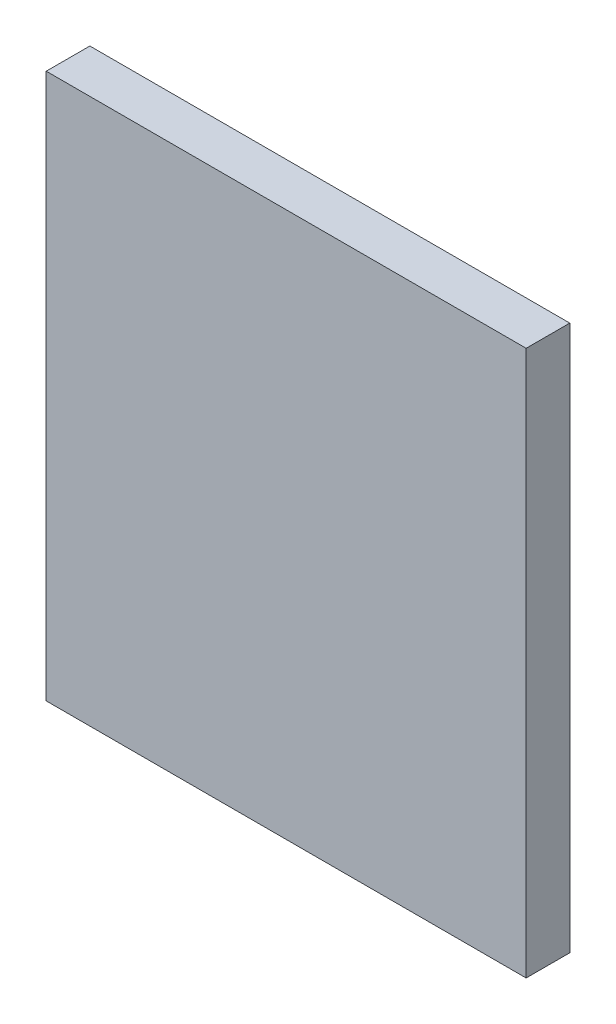
ISO-10303-21;
HEADER;
FILE_DESCRIPTION(('STEP AP214'),'2;1');
FILE_NAME('part.step','',(''),(''),'','','');
FILE_SCHEMA(('AUTOMOTIVE_DESIGN { 1 0 10303 214 1 1 1 1 }'));
ENDSEC;
DATA;
#1=APPLICATION_CONTEXT('core data for automotive mechanical design processes');
#2=APPLICATION_PROTOCOL_DEFINITION('international standard','automotive_design',2000,#1);
#3=PRODUCT_CONTEXT('',#1,'mechanical');
#4=PRODUCT('Part','Part','',(#3));
#5=PRODUCT_RELATED_PRODUCT_CATEGORY('part','',(#4));
#6=PRODUCT_DEFINITION_FORMATION('','',#4);
#7=PRODUCT_DEFINITION_CONTEXT('part definition',#1,'design');
#8=PRODUCT_DEFINITION('design','',#6,#7);
#9=PRODUCT_DEFINITION_SHAPE('','',#8);
#10=(LENGTH_UNIT() NAMED_UNIT(*) SI_UNIT(.MILLI.,.METRE.));
#11=(NAMED_UNIT(*) PLANE_ANGLE_UNIT() SI_UNIT($,.RADIAN.));
#12=(NAMED_UNIT(*) SI_UNIT($,.STERADIAN.) SOLID_ANGLE_UNIT());
#13=UNCERTAINTY_MEASURE_WITH_UNIT(LENGTH_MEASURE(1.E-05),#10,'distance_accuracy_value','');
#14=(GEOMETRIC_REPRESENTATION_CONTEXT(3) GLOBAL_UNCERTAINTY_ASSIGNED_CONTEXT((#13)) GLOBAL_UNIT_ASSIGNED_CONTEXT((#10,
#11,#12)) REPRESENTATION_CONTEXT('',''));
#15=CARTESIAN_POINT('',(0.,0.,0.));
#16=DIRECTION('',(0.,0.,1.));
#17=DIRECTION('',(1.,0.,0.));
#18=AXIS2_PLACEMENT_3D('',#15,#16,#17);
#19=CARTESIAN_POINT('',(0.,0.,2.));
#20=DIRECTION('',(1.,0.,0.));
#21=DIRECTION('',(0.,0.,-1.));
#22=AXIS2_PLACEMENT_3D('',#19,#20,#21);
#23=PLANE('',#22);
#24=DIRECTION('',(0.,-1.,0.));
#25=VECTOR('',#24,1.);
#26=CARTESIAN_POINT('',(0.,0.,0.));
#27=LINE('',#26,#25);
#28=CARTESIAN_POINT('',(0.,25.,0.));
#29=VERTEX_POINT('',#28);
#30=CARTESIAN_POINT('',(0.,0.,0.));
#31=VERTEX_POINT('',#30);
#32=EDGE_CURVE('E100',#29,#31,#27,.T.);
#33=ORIENTED_EDGE('',*,*,#32,.T.);
#34=DIRECTION('',(0.,0.,-1.));
#35=VECTOR('',#34,1.);
#36=CARTESIAN_POINT('',(0.,0.,2.));
#37=LINE('',#36,#35);
#38=CARTESIAN_POINT('',(0.,0.,2.));
#39=VERTEX_POINT('',#38);
#40=EDGE_CURVE('E11',#39,#31,#37,.T.);
#41=ORIENTED_EDGE('',*,*,#40,.F.);
#42=DIRECTION('',(0.,-1.,0.));
#43=VECTOR('',#42,1.);
#44=CARTESIAN_POINT('',(0.,0.,2.));
#45=LINE('',#44,#43);
#46=CARTESIAN_POINT('',(0.,25.,2.));
#47=VERTEX_POINT('',#46);
#48=EDGE_CURVE('E88',#47,#39,#45,.T.);
#49=ORIENTED_EDGE('',*,*,#48,.F.);
#50=DIRECTION('',(0.,0.,-1.));
#51=VECTOR('',#50,1.);
#52=CARTESIAN_POINT('',(0.,25.,2.));
#53=LINE('',#52,#51);
#54=EDGE_CURVE('E96',#47,#29,#53,.T.);
#55=ORIENTED_EDGE('',*,*,#54,.T.);
#56=EDGE_LOOP('',(#33,#41,#49,#55));
#57=FACE_BOUND('',#56,.T.);
#58=ADVANCED_FACE('F37',(#57),#23,.F.);
#59=CARTESIAN_POINT('',(0.,0.,2.));
#60=DIRECTION('',(0.,1.,0.));
#61=DIRECTION('',(0.,0.,1.));
#62=AXIS2_PLACEMENT_3D('',#59,#60,#61);
#63=PLANE('',#62);
#64=DIRECTION('',(1.,0.,0.));
#65=VECTOR('',#64,1.);
#66=CARTESIAN_POINT('',(0.,0.,0.));
#67=LINE('',#66,#65);
#68=CARTESIAN_POINT('',(22.,0.,0.));
#69=VERTEX_POINT('',#68);
#70=EDGE_CURVE('E92',#31,#69,#67,.T.);
#71=ORIENTED_EDGE('',*,*,#70,.T.);
#72=DIRECTION('',(0.,0.,-1.));
#73=VECTOR('',#72,1.);
#74=CARTESIAN_POINT('',(22.,0.,2.));
#75=LINE('',#74,#73);
#76=CARTESIAN_POINT('',(22.,0.,2.));
#77=VERTEX_POINT('',#76);
#78=EDGE_CURVE('E45',#77,#69,#75,.T.);
#79=ORIENTED_EDGE('',*,*,#78,.F.);
#80=DIRECTION('',(1.,0.,0.));
#81=VECTOR('',#80,1.);
#82=CARTESIAN_POINT('',(0.,0.,2.));
#83=LINE('',#82,#81);
#84=EDGE_CURVE('E83',#39,#77,#83,.T.);
#85=ORIENTED_EDGE('',*,*,#84,.F.);
#86=ORIENTED_EDGE('',*,*,#40,.T.);
#87=EDGE_LOOP('',(#71,#79,#85,#86));
#88=FACE_BOUND('',#87,.T.);
#89=ADVANCED_FACE('F91',(#88),#63,.F.);
#90=CARTESIAN_POINT('',(22.,0.,2.));
#91=DIRECTION('',(-1.,0.,0.));
#92=DIRECTION('',(0.,0.,1.));
#93=AXIS2_PLACEMENT_3D('',#90,#91,#92);
#94=PLANE('',#93);
#95=DIRECTION('',(0.,1.,0.));
#96=VECTOR('',#95,1.);
#97=CARTESIAN_POINT('',(22.,0.,0.));
#98=LINE('',#97,#96);
#99=CARTESIAN_POINT('',(22.,25.,0.));
#100=VERTEX_POINT('',#99);
#101=EDGE_CURVE('E70',#69,#100,#98,.T.);
#102=ORIENTED_EDGE('',*,*,#101,.T.);
#103=DIRECTION('',(0.,0.,-1.));
#104=VECTOR('',#103,1.);
#105=CARTESIAN_POINT('',(22.,25.,2.));
#106=LINE('',#105,#104);
#107=CARTESIAN_POINT('',(22.,25.,2.));
#108=VERTEX_POINT('',#107);
#109=EDGE_CURVE('E93',#108,#100,#106,.T.);
#110=ORIENTED_EDGE('',*,*,#109,.F.);
#111=DIRECTION('',(0.,1.,0.));
#112=VECTOR('',#111,1.);
#113=CARTESIAN_POINT('',(22.,0.,2.));
#114=LINE('',#113,#112);
#115=EDGE_CURVE('E86',#77,#108,#114,.T.);
#116=ORIENTED_EDGE('',*,*,#115,.F.);
#117=ORIENTED_EDGE('',*,*,#78,.T.);
#118=EDGE_LOOP('',(#102,#110,#116,#117));
#119=FACE_BOUND('',#118,.T.);
#120=ADVANCED_FACE('F94',(#119),#94,.F.);
#121=CARTESIAN_POINT('',(0.,25.,2.));
#122=DIRECTION('',(0.,-1.,0.));
#123=DIRECTION('',(0.,0.,-1.));
#124=AXIS2_PLACEMENT_3D('',#121,#122,#123);
#125=PLANE('',#124);
#126=DIRECTION('',(-1.,0.,0.));
#127=VECTOR('',#126,1.);
#128=CARTESIAN_POINT('',(0.,25.,0.));
#129=LINE('',#128,#127);
#130=EDGE_CURVE('E76',#100,#29,#129,.T.);
#131=ORIENTED_EDGE('',*,*,#130,.T.);
#132=ORIENTED_EDGE('',*,*,#54,.F.);
#133=DIRECTION('',(-1.,0.,0.));
#134=VECTOR('',#133,1.);
#135=CARTESIAN_POINT('',(0.,25.,2.));
#136=LINE('',#135,#134);
#137=EDGE_CURVE('E53',#108,#47,#136,.T.);
#138=ORIENTED_EDGE('',*,*,#137,.F.);
#139=ORIENTED_EDGE('',*,*,#109,.T.);
#140=EDGE_LOOP('',(#131,#132,#138,#139));
#141=FACE_BOUND('',#140,.T.);
#142=ADVANCED_FACE('F107',(#141),#125,.F.);
#143=CARTESIAN_POINT('',(0.,0.,2.));
#144=DIRECTION('',(0.,0.,-1.));
#145=DIRECTION('',(-1.,0.,0.));
#146=AXIS2_PLACEMENT_3D('',#143,#144,#145);
#147=PLANE('',#146);
#148=ORIENTED_EDGE('',*,*,#48,.T.);
#149=ORIENTED_EDGE('',*,*,#84,.T.);
#150=ORIENTED_EDGE('',*,*,#115,.T.);
#151=ORIENTED_EDGE('',*,*,#137,.T.);
#152=EDGE_LOOP('',(#148,#149,#150,#151));
#153=FACE_BOUND('',#152,.T.);
#154=ADVANCED_FACE('F84',(#153),#147,.F.);
#155=CARTESIAN_POINT('',(0.,0.,0.));
#156=DIRECTION('',(0.,0.,-1.));
#157=DIRECTION('',(-1.,0.,0.));
#158=AXIS2_PLACEMENT_3D('',#155,#156,#157);
#159=PLANE('',#158);
#160=ORIENTED_EDGE('',*,*,#32,.F.);
#161=ORIENTED_EDGE('',*,*,#130,.F.);
#162=ORIENTED_EDGE('',*,*,#101,.F.);
#163=ORIENTED_EDGE('',*,*,#70,.F.);
#164=EDGE_LOOP('',(#160,#161,#162,#163));
#165=FACE_BOUND('',#164,.T.);
#166=ADVANCED_FACE('F110',(#165),#159,.T.);
#167=CLOSED_SHELL('',(#58,#89,#120,#142,#154,#166));
#168=MANIFOLD_SOLID_BREP('B2',#167);
#169=ADVANCED_BREP_SHAPE_REPRESENTATION('',(#18,#168),#14);
#170=SHAPE_DEFINITION_REPRESENTATION(#9,#169);
ENDSEC;
END-ISO-10303-21;
